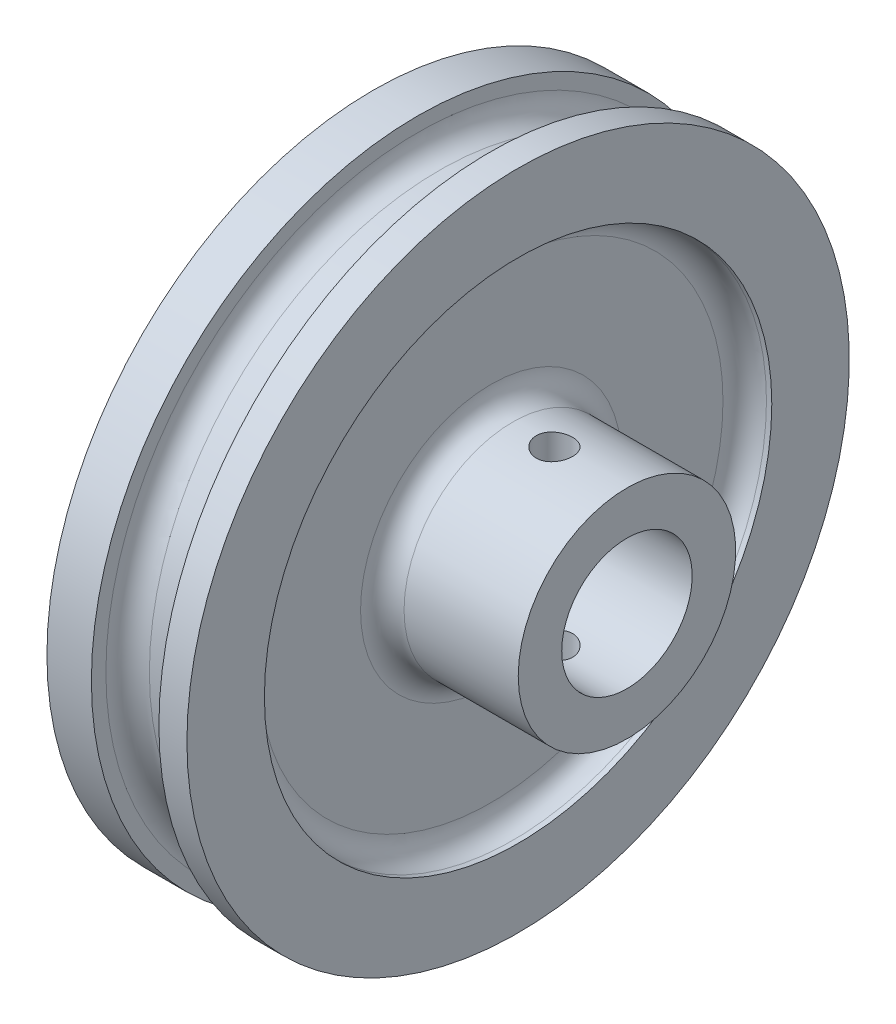
ISO-10303-21;
HEADER;
FILE_DESCRIPTION(('STEP AP214'),'2;1');
FILE_NAME('part.step','',(''),(''),'','','');
FILE_SCHEMA(('AUTOMOTIVE_DESIGN { 1 0 10303 214 1 1 1 1 }'));
ENDSEC;
DATA;
#1=APPLICATION_CONTEXT('core data for automotive mechanical design processes');
#2=APPLICATION_PROTOCOL_DEFINITION('international standard','automotive_design',2000,#1);
#3=PRODUCT_CONTEXT('',#1,'mechanical');
#4=PRODUCT('Part','Part','',(#3));
#5=PRODUCT_RELATED_PRODUCT_CATEGORY('part','',(#4));
#6=PRODUCT_DEFINITION_FORMATION('','',#4);
#7=PRODUCT_DEFINITION_CONTEXT('part definition',#1,'design');
#8=PRODUCT_DEFINITION('design','',#6,#7);
#9=PRODUCT_DEFINITION_SHAPE('','',#8);
#10=(LENGTH_UNIT() NAMED_UNIT(*) SI_UNIT(.MILLI.,.METRE.));
#11=(NAMED_UNIT(*) PLANE_ANGLE_UNIT() SI_UNIT($,.RADIAN.));
#12=(NAMED_UNIT(*) SI_UNIT($,.STERADIAN.) SOLID_ANGLE_UNIT());
#13=UNCERTAINTY_MEASURE_WITH_UNIT(LENGTH_MEASURE(1.E-05),#10,'distance_accuracy_value','');
#14=(GEOMETRIC_REPRESENTATION_CONTEXT(3) GLOBAL_UNCERTAINTY_ASSIGNED_CONTEXT((#13)) GLOBAL_UNIT_ASSIGNED_CONTEXT((#10,
#11,#12)) REPRESENTATION_CONTEXT('',''));
#15=CARTESIAN_POINT('',(0.,0.,0.));
#16=DIRECTION('',(0.,0.,1.));
#17=DIRECTION('',(1.,0.,0.));
#18=AXIS2_PLACEMENT_3D('',#15,#16,#17);
#19=CARTESIAN_POINT('',(-13.6376047809108,45.,0.));
#20=DIRECTION('',(1.,0.,0.));
#21=DIRECTION('',(0.,0.,-1.));
#22=AXIS2_PLACEMENT_3D('',#19,#20,#21);
#23=PLANE('',#22);
#24=CARTESIAN_POINT('',(-13.6376047809108,0.,0.));
#25=DIRECTION('',(-1.,0.,0.));
#26=DIRECTION('',(0.,0.,1.));
#27=AXIS2_PLACEMENT_3D('',#24,#25,#26);
#28=CIRCLE('',#27,9.);
#29=CARTESIAN_POINT('',(-13.6376047809108,0.,9.));
#30=VERTEX_POINT('',#29);
#31=EDGE_CURVE('E201',#30,#30,#28,.T.);
#32=ORIENTED_EDGE('',*,*,#31,.F.);
#33=EDGE_LOOP('',(#32));
#34=FACE_BOUND('',#33,.T.);
#35=CARTESIAN_POINT('',(-13.6376047809108,0.,0.));
#36=DIRECTION('',(-1.,0.,0.));
#37=DIRECTION('',(0.,0.,1.));
#38=AXIS2_PLACEMENT_3D('',#35,#36,#37);
#39=CIRCLE('',#38,45.);
#40=CARTESIAN_POINT('',(-13.6376047809108,0.,45.));
#41=VERTEX_POINT('',#40);
#42=EDGE_CURVE('E10',#41,#41,#39,.T.);
#43=ORIENTED_EDGE('',*,*,#42,.T.);
#44=EDGE_LOOP('',(#43));
#45=FACE_BOUND('',#44,.T.);
#46=ADVANCED_FACE('F37',(#34,#45),#23,.F.);
#47=CARTESIAN_POINT('',(-27.2989690721649,0.,0.));
#48=DIRECTION('',(-1.,0.,0.));
#49=DIRECTION('',(0.,0.,1.));
#50=AXIS2_PLACEMENT_3D('',#47,#48,#49);
#51=CYLINDRICAL_SURFACE('',#50,45.);
#52=ORIENTED_EDGE('',*,*,#42,.F.);
#53=EDGE_LOOP('',(#52));
#54=FACE_BOUND('',#53,.T.);
#55=CARTESIAN_POINT('',(-7.50515463917525,0.,0.));
#56=DIRECTION('',(-1.,0.,0.));
#57=DIRECTION('',(0.,0.,1.));
#58=AXIS2_PLACEMENT_3D('',#55,#56,#57);
#59=CIRCLE('',#58,45.);
#60=CARTESIAN_POINT('',(-7.50515463917525,0.,45.));
#61=VERTEX_POINT('',#60);
#62=EDGE_CURVE('E50',#61,#61,#59,.T.);
#63=ORIENTED_EDGE('',*,*,#62,.T.);
#64=EDGE_LOOP('',(#63));
#65=FACE_BOUND('',#64,.T.);
#66=ADVANCED_FACE('F139',(#54,#65),#51,.T.);
#67=CARTESIAN_POINT('',(-7.50515463917525,43.,0.));
#68=DIRECTION('',(-1.,0.,0.));
#69=DIRECTION('',(0.,0.,1.));
#70=AXIS2_PLACEMENT_3D('',#67,#68,#69);
#71=PLANE('',#70);
#72=ORIENTED_EDGE('',*,*,#62,.F.);
#73=EDGE_LOOP('',(#72));
#74=FACE_BOUND('',#73,.T.);
#75=CARTESIAN_POINT('',(-7.50515463917525,0.,0.));
#76=DIRECTION('',(-1.,0.,0.));
#77=DIRECTION('',(0.,0.,1.));
#78=AXIS2_PLACEMENT_3D('',#75,#76,#77);
#79=CIRCLE('',#78,43.);
#80=CARTESIAN_POINT('',(-7.50515463917525,0.,43.));
#81=VERTEX_POINT('',#80);
#82=EDGE_CURVE('E56',#81,#81,#79,.T.);
#83=ORIENTED_EDGE('',*,*,#82,.T.);
#84=EDGE_LOOP('',(#83));
#85=FACE_BOUND('',#84,.T.);
#86=ADVANCED_FACE('F136',(#74,#85),#71,.F.);
#87=CARTESIAN_POINT('',(-4.50515463917525,0.,0.));
#88=DIRECTION('',(-1.,0.,0.));
#89=DIRECTION('',(0.,0.,1.));
#90=AXIS2_PLACEMENT_3D('',#87,#88,#89);
#91=TOROIDAL_SURFACE('',#90,43.,3.);
#92=ORIENTED_EDGE('',*,*,#82,.F.);
#93=EDGE_LOOP('',(#92));
#94=FACE_BOUND('',#93,.T.);
#95=CARTESIAN_POINT('',(-4.50515463917523,0.,0.));
#96=DIRECTION('',(-1.,0.,0.));
#97=DIRECTION('',(0.,0.,1.));
#98=AXIS2_PLACEMENT_3D('',#95,#96,#97);
#99=CIRCLE('',#98,40.);
#100=CARTESIAN_POINT('',(-4.50515463917523,0.,40.));
#101=VERTEX_POINT('',#100);
#102=EDGE_CURVE('E153',#101,#101,#99,.T.);
#103=ORIENTED_EDGE('',*,*,#102,.T.);
#104=EDGE_LOOP('',(#103));
#105=FACE_BOUND('',#104,.T.);
#106=ADVANCED_FACE('F132',(#94,#105),#91,.F.);
#107=CARTESIAN_POINT('',(-27.2989690721649,0.,0.));
#108=DIRECTION('',(-1.,0.,0.));
#109=DIRECTION('',(0.,0.,1.));
#110=AXIS2_PLACEMENT_3D('',#107,#108,#109);
#111=CYLINDRICAL_SURFACE('',#110,40.);
#112=ORIENTED_EDGE('',*,*,#102,.F.);
#113=EDGE_LOOP('',(#112));
#114=FACE_BOUND('',#113,.T.);
#115=CARTESIAN_POINT('',(-0.505154639175269,0.,0.));
#116=DIRECTION('',(-1.,0.,0.));
#117=DIRECTION('',(0.,0.,1.));
#118=AXIS2_PLACEMENT_3D('',#115,#116,#117);
#119=CIRCLE('',#118,40.);
#120=CARTESIAN_POINT('',(-0.505154639175269,0.,40.));
#121=VERTEX_POINT('',#120);
#122=EDGE_CURVE('E156',#121,#121,#119,.T.);
#123=ORIENTED_EDGE('',*,*,#122,.T.);
#124=EDGE_LOOP('',(#123));
#125=FACE_BOUND('',#124,.T.);
#126=ADVANCED_FACE('F128',(#114,#125),#111,.T.);
#127=CARTESIAN_POINT('',(-0.505154639175247,0.,0.));
#128=DIRECTION('',(-1.,0.,0.));
#129=DIRECTION('',(0.,0.,1.));
#130=AXIS2_PLACEMENT_3D('',#127,#128,#129);
#131=TOROIDAL_SURFACE('',#130,43.,3.);
#132=ORIENTED_EDGE('',*,*,#122,.F.);
#133=EDGE_LOOP('',(#132));
#134=FACE_BOUND('',#133,.T.);
#135=CARTESIAN_POINT('',(2.49484536082475,0.,0.));
#136=DIRECTION('',(-1.,0.,0.));
#137=DIRECTION('',(0.,0.,1.));
#138=AXIS2_PLACEMENT_3D('',#135,#136,#137);
#139=CIRCLE('',#138,43.);
#140=CARTESIAN_POINT('',(2.49484536082475,0.,43.));
#141=VERTEX_POINT('',#140);
#142=EDGE_CURVE('E162',#141,#141,#139,.T.);
#143=ORIENTED_EDGE('',*,*,#142,.T.);
#144=EDGE_LOOP('',(#143));
#145=FACE_BOUND('',#144,.T.);
#146=ADVANCED_FACE('F124',(#134,#145),#131,.F.);
#147=CARTESIAN_POINT('',(2.49484536082475,45.6877000419531,0.));
#148=DIRECTION('',(1.,0.,0.));
#149=DIRECTION('',(0.,0.,-1.));
#150=AXIS2_PLACEMENT_3D('',#147,#148,#149);
#151=PLANE('',#150);
#152=ORIENTED_EDGE('',*,*,#142,.F.);
#153=EDGE_LOOP('',(#152));
#154=FACE_BOUND('',#153,.T.);
#155=CARTESIAN_POINT('',(2.49484536082475,0.,0.));
#156=DIRECTION('',(-1.,0.,0.));
#157=DIRECTION('',(0.,0.,1.));
#158=AXIS2_PLACEMENT_3D('',#155,#156,#157);
#159=CIRCLE('',#158,45.6877000419531);
#160=CARTESIAN_POINT('',(2.49484536082475,0.,45.6877000419531));
#161=VERTEX_POINT('',#160);
#162=EDGE_CURVE('E166',#161,#161,#159,.T.);
#163=ORIENTED_EDGE('',*,*,#162,.T.);
#164=EDGE_LOOP('',(#163));
#165=FACE_BOUND('',#164,.T.);
#166=ADVANCED_FACE('F120',(#154,#165),#151,.F.);
#167=CARTESIAN_POINT('',(-27.2989690721649,0.,0.));
#168=DIRECTION('',(-1.,0.,0.));
#169=DIRECTION('',(0.,0.,1.));
#170=AXIS2_PLACEMENT_3D('',#167,#168,#169);
#171=CYLINDRICAL_SURFACE('',#170,45.6877000419531);
#172=ORIENTED_EDGE('',*,*,#162,.F.);
#173=EDGE_LOOP('',(#172));
#174=FACE_BOUND('',#173,.T.);
#175=CARTESIAN_POINT('',(6.36239521908918,0.,0.));
#176=DIRECTION('',(-1.,0.,0.));
#177=DIRECTION('',(0.,0.,1.));
#178=AXIS2_PLACEMENT_3D('',#175,#176,#177);
#179=CIRCLE('',#178,45.6877000419531);
#180=CARTESIAN_POINT('',(6.36239521908918,0.,45.6877000419531));
#181=VERTEX_POINT('',#180);
#182=EDGE_CURVE('E170',#181,#181,#179,.T.);
#183=ORIENTED_EDGE('',*,*,#182,.T.);
#184=EDGE_LOOP('',(#183));
#185=FACE_BOUND('',#184,.T.);
#186=ADVANCED_FACE('F116',(#174,#185),#171,.T.);
#187=CARTESIAN_POINT('',(6.36239521908918,35.,0.));
#188=DIRECTION('',(-1.,0.,0.));
#189=DIRECTION('',(0.,0.,1.));
#190=AXIS2_PLACEMENT_3D('',#187,#188,#189);
#191=PLANE('',#190);
#192=ORIENTED_EDGE('',*,*,#182,.F.);
#193=EDGE_LOOP('',(#192));
#194=FACE_BOUND('',#193,.T.);
#195=CARTESIAN_POINT('',(6.36239521908918,0.,0.));
#196=DIRECTION('',(-1.,0.,0.));
#197=DIRECTION('',(0.,0.,1.));
#198=AXIS2_PLACEMENT_3D('',#195,#196,#197);
#199=CIRCLE('',#198,35.);
#200=CARTESIAN_POINT('',(6.36239521908918,0.,35.));
#201=VERTEX_POINT('',#200);
#202=EDGE_CURVE('E174',#201,#201,#199,.T.);
#203=ORIENTED_EDGE('',*,*,#202,.T.);
#204=EDGE_LOOP('',(#203));
#205=FACE_BOUND('',#204,.T.);
#206=ADVANCED_FACE('F112',(#194,#205),#191,.F.);
#207=CARTESIAN_POINT('',(-27.2989690721649,0.,0.));
#208=DIRECTION('',(-1.,0.,0.));
#209=DIRECTION('',(0.,0.,1.));
#210=AXIS2_PLACEMENT_3D('',#207,#208,#209);
#211=CYLINDRICAL_SURFACE('',#210,35.);
#212=ORIENTED_EDGE('',*,*,#202,.F.);
#213=EDGE_LOOP('',(#212));
#214=FACE_BOUND('',#213,.T.);
#215=CARTESIAN_POINT('',(5.62724428910501,0.,0.));
#216=DIRECTION('',(-1.,0.,0.));
#217=DIRECTION('',(0.,0.,1.));
#218=AXIS2_PLACEMENT_3D('',#215,#216,#217);
#219=CIRCLE('',#218,35.);
#220=CARTESIAN_POINT('',(5.62724428910501,0.,35.));
#221=VERTEX_POINT('',#220);
#222=EDGE_CURVE('E178',#221,#221,#219,.T.);
#223=ORIENTED_EDGE('',*,*,#222,.T.);
#224=EDGE_LOOP('',(#223));
#225=FACE_BOUND('',#224,.T.);
#226=ADVANCED_FACE('F108',(#214,#225),#211,.F.);
#227=CARTESIAN_POINT('',(5.62724428910499,0.,0.));
#228=DIRECTION('',(-1.,0.,0.));
#229=DIRECTION('',(0.,0.,1.));
#230=AXIS2_PLACEMENT_3D('',#227,#228,#229);
#231=TOROIDAL_SURFACE('',#230,32.,3.);
#232=ORIENTED_EDGE('',*,*,#222,.F.);
#233=EDGE_LOOP('',(#232));
#234=FACE_BOUND('',#233,.T.);
#235=CARTESIAN_POINT('',(2.62724428910499,0.,0.));
#236=DIRECTION('',(-1.,0.,0.));
#237=DIRECTION('',(0.,0.,1.));
#238=AXIS2_PLACEMENT_3D('',#235,#236,#237);
#239=CIRCLE('',#238,32.);
#240=CARTESIAN_POINT('',(2.62724428910499,0.,32.));
#241=VERTEX_POINT('',#240);
#242=EDGE_CURVE('E182',#241,#241,#239,.T.);
#243=ORIENTED_EDGE('',*,*,#242,.T.);
#244=EDGE_LOOP('',(#243));
#245=FACE_BOUND('',#244,.T.);
#246=ADVANCED_FACE('F104',(#234,#245),#231,.F.);
#247=CARTESIAN_POINT('',(2.62724428910499,18.,0.));
#248=DIRECTION('',(-1.,0.,0.));
#249=DIRECTION('',(0.,0.,1.));
#250=AXIS2_PLACEMENT_3D('',#247,#248,#249);
#251=PLANE('',#250);
#252=ORIENTED_EDGE('',*,*,#242,.F.);
#253=EDGE_LOOP('',(#252));
#254=FACE_BOUND('',#253,.T.);
#255=CARTESIAN_POINT('',(2.62724428910499,0.,0.));
#256=DIRECTION('',(-1.,0.,0.));
#257=DIRECTION('',(0.,0.,1.));
#258=AXIS2_PLACEMENT_3D('',#255,#256,#257);
#259=CIRCLE('',#258,18.);
#260=CARTESIAN_POINT('',(2.62724428910499,0.,18.));
#261=VERTEX_POINT('',#260);
#262=EDGE_CURVE('E186',#261,#261,#259,.T.);
#263=ORIENTED_EDGE('',*,*,#262,.T.);
#264=EDGE_LOOP('',(#263));
#265=FACE_BOUND('',#264,.T.);
#266=ADVANCED_FACE('F100',(#254,#265),#251,.F.);
#267=CARTESIAN_POINT('',(5.62724428910499,0.,0.));
#268=DIRECTION('',(-1.,0.,0.));
#269=DIRECTION('',(0.,0.,1.));
#270=AXIS2_PLACEMENT_3D('',#267,#268,#269);
#271=TOROIDAL_SURFACE('',#270,18.,3.);
#272=ORIENTED_EDGE('',*,*,#262,.F.);
#273=EDGE_LOOP('',(#272));
#274=FACE_BOUND('',#273,.T.);
#275=CARTESIAN_POINT('',(5.62724428910501,0.,0.));
#276=DIRECTION('',(-1.,0.,0.));
#277=DIRECTION('',(0.,0.,1.));
#278=AXIS2_PLACEMENT_3D('',#275,#276,#277);
#279=CIRCLE('',#278,15.);
#280=CARTESIAN_POINT('',(5.62724428910501,0.,15.));
#281=VERTEX_POINT('',#280);
#282=EDGE_CURVE('E190',#281,#281,#279,.T.);
#283=ORIENTED_EDGE('',*,*,#282,.T.);
#284=EDGE_LOOP('',(#283));
#285=FACE_BOUND('',#284,.T.);
#286=ADVANCED_FACE('F95',(#274,#285),#271,.F.);
#287=CARTESIAN_POINT('',(-27.2989690721649,0.,0.));
#288=DIRECTION('',(-1.,0.,0.));
#289=DIRECTION('',(0.,0.,1.));
#290=AXIS2_PLACEMENT_3D('',#287,#288,#289);
#291=CYLINDRICAL_SURFACE('',#290,15.);
#292=CARTESIAN_POINT('',(11.3798216086926,-14.790199457749,2.5));
#293=CARTESIAN_POINT('',(11.5191973568544,-14.790201973666,2.49999439841982));
#294=CARTESIAN_POINT('',(11.6586492147641,-14.7921909238523,2.48830516902828));
#295=CARTESIAN_POINT('',(11.9336401519558,-14.7999245720004,2.44187742806637));
#296=CARTESIAN_POINT('',(12.0691755024507,-14.8056727334637,2.40711766030861));
#297=CARTESIAN_POINT('',(12.3323138920342,-14.8202560936731,2.31562954367049));
#298=CARTESIAN_POINT('',(12.4599234573549,-14.8290887118401,2.25891955493199));
#299=CARTESIAN_POINT('',(12.7038025634104,-14.8488427210228,2.12518649688947));
#300=CARTESIAN_POINT('',(12.82007337827,-14.8597638769423,2.04816571350133));
#301=CARTESIAN_POINT('',(13.0391344584372,-14.8825847115588,1.87518752696654));
#302=CARTESIAN_POINT('',(13.1417967400788,-14.8944921732795,1.77906904893234));
#303=CARTESIAN_POINT('',(13.3296149155544,-14.9178748066858,1.57097200469527));
#304=CARTESIAN_POINT('',(13.414769771808,-14.9293499527174,1.45899249914997));
#305=CARTESIAN_POINT('',(13.5656361759119,-14.9506573698271,1.22152286994835));
#306=CARTESIAN_POINT('',(13.6312286164244,-14.9604794243234,1.09595608145671));
#307=CARTESIAN_POINT('',(13.7403426792232,-14.9772873695709,0.835395621723867));
#308=CARTESIAN_POINT('',(13.7838657365775,-14.9842734447266,0.700402564078187));
#309=CARTESIAN_POINT('',(13.8472141436765,-14.994567347244,0.426143726344242));
#310=CARTESIAN_POINT('',(13.8672545246973,-14.9979085311091,0.286928886679271));
#311=CARTESIAN_POINT('',(13.8837373628452,-15.0006507934278,0.00707528552579728));
#312=CARTESIAN_POINT('',(13.8801814239399,-15.0000521396931,-0.133563378528898));
#313=CARTESIAN_POINT('',(13.8497402571644,-14.9950085843139,-0.410802185078875));
#314=CARTESIAN_POINT('',(13.8230864452835,-14.990601836924,-0.54742853070014));
#315=CARTESIAN_POINT('',(13.7475705344461,-14.9784797877164,-0.81424197961179));
#316=CARTESIAN_POINT('',(13.6987077591031,-14.9707643851321,-0.944428886651503));
#317=CARTESIAN_POINT('',(13.5799309683773,-14.9528269851196,-1.19535614778265));
#318=CARTESIAN_POINT('',(13.5099215966102,-14.9425936732688,-1.31605052301904));
#319=CARTESIAN_POINT('',(13.3509087860576,-14.920757380715,-1.54406552984664));
#320=CARTESIAN_POINT('',(13.2619038099818,-14.9091542891913,-1.65138507791587));
#321=CARTESIAN_POINT('',(13.0661428020733,-14.885702682326,-1.85097127344666));
#322=CARTESIAN_POINT('',(12.9591845137916,-14.8738528973104,-1.94303950225321));
#323=CARTESIAN_POINT('',(12.7312345184768,-14.8513795978481,-2.10795458844806));
#324=CARTESIAN_POINT('',(12.6102426820098,-14.8407560947132,-2.18080126853242));
#325=CARTESIAN_POINT('',(12.3574299668151,-14.8219375456182,-2.30524443448828));
#326=CARTESIAN_POINT('',(12.2255971106005,-14.813745233026,-2.35681702727924));
#327=CARTESIAN_POINT('',(11.9549725363851,-14.8007618868988,-2.43702987081562));
#328=CARTESIAN_POINT('',(11.8161814322602,-14.7959705538832,-2.46567214076795));
#329=CARTESIAN_POINT('',(11.5373554525305,-14.7903895942212,-2.49893188487926));
#330=CARTESIAN_POINT('',(11.3973552289905,-14.7895528575867,-2.50383220791244));
#331=CARTESIAN_POINT('',(11.1185349370018,-14.7918503478236,-2.49022270268246));
#332=CARTESIAN_POINT('',(10.9797148231787,-14.7949844213185,-2.47171377862466));
#333=CARTESIAN_POINT('',(10.7080938495018,-14.8048268745502,-2.4120523349281));
#334=CARTESIAN_POINT('',(10.5752604688146,-14.8115125191835,-2.37104379064638));
#335=CARTESIAN_POINT('',(10.3183514424131,-14.827685730055,-2.26769819019228));
#336=CARTESIAN_POINT('',(10.1942763211417,-14.8371734639058,-2.20535985810094));
#337=CARTESIAN_POINT('',(9.95714701428651,-14.8579912839739,-2.06045667322923));
#338=CARTESIAN_POINT('',(9.84420503593656,-14.8693375560035,-1.97771056415936));
#339=CARTESIAN_POINT('',(9.63370807599762,-14.8925466667987,-1.79458946570798));
#340=CARTESIAN_POINT('',(9.53615417758288,-14.9044095418533,-1.69421323638404));
#341=CARTESIAN_POINT('',(9.35816971596392,-14.9274642211826,-1.47742807032881));
#342=CARTESIAN_POINT('',(9.27792778240808,-14.9386477634467,-1.3608632533862));
#343=CARTESIAN_POINT('',(9.13816628168774,-14.9589511243294,-1.11574344794933));
#344=CARTESIAN_POINT('',(9.07864604421877,-14.9680710096998,-0.987188847470626));
#345=CARTESIAN_POINT('',(8.98231102473776,-14.9831835816958,-0.722299051501328));
#346=CARTESIAN_POINT('',(8.9453975329577,-14.9891898456762,-0.586000562602611));
#347=CARTESIAN_POINT('',(8.89500600972879,-14.9974558316928,-0.309030734874212));
#348=CARTESIAN_POINT('',(8.88152604996027,-14.9997158620019,-0.168359756821621));
#349=CARTESIAN_POINT('',(8.87843972638042,-15.0002303788781,0.111541275773676));
#350=CARTESIAN_POINT('',(8.88854635475154,-14.9985330202419,0.250768160602665));
#351=CARTESIAN_POINT('',(8.93172553096205,-14.9914217838733,0.525511974314705));
#352=CARTESIAN_POINT('',(8.96479795020229,-14.9860079269518,0.661028923967478));
#353=CARTESIAN_POINT('',(9.05285977423627,-14.972069888274,0.924396445918536));
#354=CARTESIAN_POINT('',(9.10782477690267,-14.9635491704088,1.05225537215382));
#355=CARTESIAN_POINT('',(9.2380795449232,-14.9443275687803,1.29698045298217));
#356=CARTESIAN_POINT('',(9.31337027375507,-14.9336265816741,1.41384608611822));
#357=CARTESIAN_POINT('',(9.48315670115312,-14.9110762961641,1.63471294552639));
#358=CARTESIAN_POINT('',(9.57786256344388,-14.8992152454112,1.73855143060274));
#359=CARTESIAN_POINT('',(9.78334991659643,-14.8757630331437,1.92896387595091));
#360=CARTESIAN_POINT('',(9.89413516760515,-14.8641719354951,2.0155337867119));
#361=CARTESIAN_POINT('',(10.1295669311822,-14.8424834353391,2.16951427091086));
#362=CARTESIAN_POINT('',(10.2543059484581,-14.8323971784578,2.2367849890577));
#363=CARTESIAN_POINT('',(10.5134308445308,-14.8149921009131,2.34931453640427));
#364=CARTESIAN_POINT('',(10.64780693137,-14.8076705172488,2.39459535522307));
#365=CARTESIAN_POINT('',(10.88222537818,-14.7982474485649,2.45202605312742));
#366=CARTESIAN_POINT('',(10.9808484166552,-14.7952462341947,2.46998741767139));
#367=CARTESIAN_POINT('',(11.1795750935296,-14.7912213528807,2.49397629518131));
#368=CARTESIAN_POINT('',(11.2796787050168,-14.7901976500369,2.50000402479277));
#369=CARTESIAN_POINT('',(11.3798216086926,-14.790199457749,2.5));
#370=B_SPLINE_CURVE_WITH_KNOTS('',3,(#292,#293,#294,#295,#296,#297,#298,#299,#300,#301,#302,
#303,#304,#305,#306,#307,#308,#309,#310,#311,#312,#313,#314,#315,#316,#317,#318,#319,#320,#321,
#322,#323,#324,#325,#326,#327,#328,#329,#330,#331,#332,#333,#334,#335,#336,#337,#338,#339,#340,
#341,#342,#343,#344,#345,#346,#347,#348,#349,#350,#351,#352,#353,#354,#355,#356,#357,#358,#359,
#360,#361,#362,#363,#364,#365,#366,#367,#368,#369),.UNSPECIFIED.,.T.,.F.,(4,2,2,2,2,2,2,2,2,2,2,
2,2,2,2,2,2,2,2,2,2,2,2,2,2,2,2,2,2,2,2,2,2,2,2,2,2,2,4),(0.,0.41776103892774,0.83590751996297,
1.25370499787519,1.67145547405274,2.09289159155714,2.51435267834447,2.93832980111435,
3.36227935111113,3.78231567472565,4.20232344652692,4.61817121164668,5.03403164249533,
5.45179604139425,5.86959426226764,6.29246123462123,6.71533210746018,7.13867662498603,
7.56198385938076,7.9802354242041,8.39847083413975,8.81406064635491,9.22967532293574,
9.64912342762701,10.0686010443069,10.4924411303538,10.916267504767,11.3382298441765,
11.7601574591235,12.1769777626592,12.5937957321882,13.0101503983246,13.4265248039233,
13.8476699746325,14.2689137888181,14.6931372761832,15.1169356674445,15.4171067054376,
15.7172722940182),.UNSPECIFIED.);
#371=CARTESIAN_POINT('',(11.3798216086926,-14.790199457749,2.5));
#372=VERTEX_POINT('',#371);
#373=EDGE_CURVE('E85',#372,#372,#370,.T.);
#374=ORIENTED_EDGE('',*,*,#373,.T.);
#375=EDGE_LOOP('',(#374));
#376=FACE_BOUND('',#375,.T.);
#377=CARTESIAN_POINT('',(11.3798216086926,14.790199457749,2.5));
#378=CARTESIAN_POINT('',(11.2404458605308,14.790201973666,2.49999439841982));
#379=CARTESIAN_POINT('',(11.1009940026211,14.7921909238523,2.48830516902828));
#380=CARTESIAN_POINT('',(10.8260030654295,14.7999245720004,2.44187742806637));
#381=CARTESIAN_POINT('',(10.6904677149346,14.8056727334637,2.40711766030861));
#382=CARTESIAN_POINT('',(10.427329325351,14.8202560936731,2.31562954367049));
#383=CARTESIAN_POINT('',(10.2997197600304,14.8290887118401,2.25891955493199));
#384=CARTESIAN_POINT('',(10.0558406539748,14.8488427210228,2.12518649688947));
#385=CARTESIAN_POINT('',(9.93956983911529,14.8597638769423,2.04816571350133));
#386=CARTESIAN_POINT('',(9.72050875894806,14.8825847115588,1.87518752696654));
#387=CARTESIAN_POINT('',(9.61784647730641,14.8944921732795,1.77906904893234));
#388=CARTESIAN_POINT('',(9.43002830183081,14.9178748066858,1.57097200469527));
#389=CARTESIAN_POINT('',(9.3448734455772,14.9293499527174,1.45899249914997));
#390=CARTESIAN_POINT('',(9.19400704147335,14.9506573698271,1.22152286994835));
#391=CARTESIAN_POINT('',(9.12841460096082,14.9604794243234,1.09595608145671));
#392=CARTESIAN_POINT('',(9.01930053816207,14.9772873695709,0.835395621723867));
#393=CARTESIAN_POINT('',(8.97577748080774,14.9842734447266,0.700402564078187));
#394=CARTESIAN_POINT('',(8.91242907370872,14.994567347244,0.426143726344242));
#395=CARTESIAN_POINT('',(8.89238869268793,14.9979085311091,0.286928886679271));
#396=CARTESIAN_POINT('',(8.87590585454002,15.0006507934278,0.00707528552579728));
#397=CARTESIAN_POINT('',(8.87946179344539,15.0000521396931,-0.133563378528898));
#398=CARTESIAN_POINT('',(8.90990296022083,14.9950085843139,-0.410802185078875));
#399=CARTESIAN_POINT('',(8.93655677210177,14.990601836924,-0.54742853070014));
#400=CARTESIAN_POINT('',(9.01207268293911,14.9784797877164,-0.81424197961179));
#401=CARTESIAN_POINT('',(9.06093545828212,14.9707643851321,-0.944428886651503));
#402=CARTESIAN_POINT('',(9.17971224900794,14.9528269851196,-1.19535614778265));
#403=CARTESIAN_POINT('',(9.24972162077506,14.9425936732688,-1.31605052301904));
#404=CARTESIAN_POINT('',(9.40873443132767,14.920757380715,-1.54406552984664));
#405=CARTESIAN_POINT('',(9.49773940740344,14.9091542891913,-1.65138507791587));
#406=CARTESIAN_POINT('',(9.69350041531193,14.885702682326,-1.85097127344666));
#407=CARTESIAN_POINT('',(9.8004587035936,14.8738528973104,-1.94303950225321));
#408=CARTESIAN_POINT('',(10.0284086989084,14.8513795978481,-2.10795458844806));
#409=CARTESIAN_POINT('',(10.1494005353754,14.8407560947132,-2.18080126853241));
#410=CARTESIAN_POINT('',(10.4022132505701,14.8219375456182,-2.30524443448828));
#411=CARTESIAN_POINT('',(10.5340461067847,14.813745233026,-2.35681702727924));
#412=CARTESIAN_POINT('',(10.8046706810002,14.8007618868988,-2.43702987081562));
#413=CARTESIAN_POINT('',(10.943461785125,14.7959705538832,-2.46567214076795));
#414=CARTESIAN_POINT('',(11.2222877648548,14.7903895942212,-2.49893188487927));
#415=CARTESIAN_POINT('',(11.3622879883947,14.7895528575867,-2.50383220791244));
#416=CARTESIAN_POINT('',(11.6411082803834,14.7918503478236,-2.49022270268246));
#417=CARTESIAN_POINT('',(11.7799283942066,14.7949844213185,-2.47171377862466));
#418=CARTESIAN_POINT('',(12.0515493678835,14.8048268745502,-2.4120523349281));
#419=CARTESIAN_POINT('',(12.1843827485706,14.8115125191835,-2.37104379064638));
#420=CARTESIAN_POINT('',(12.4412917749721,14.827685730055,-2.26769819019228));
#421=CARTESIAN_POINT('',(12.5653668962435,14.8371734639058,-2.20535985810094));
#422=CARTESIAN_POINT('',(12.8024962030987,14.8579912839739,-2.06045667322923));
#423=CARTESIAN_POINT('',(12.9154381814487,14.8693375560035,-1.97771056415936));
#424=CARTESIAN_POINT('',(13.1259351413876,14.8925466667987,-1.79458946570798));
#425=CARTESIAN_POINT('',(13.2234890398024,14.9044095418533,-1.69421323638404));
#426=CARTESIAN_POINT('',(13.4014735014213,14.9274642211826,-1.47742807032881));
#427=CARTESIAN_POINT('',(13.4817154349772,14.9386477634467,-1.3608632533862));
#428=CARTESIAN_POINT('',(13.6214769356975,14.9589511243294,-1.11574344794933));
#429=CARTESIAN_POINT('',(13.6809971731665,14.9680710096998,-0.987188847470626));
#430=CARTESIAN_POINT('',(13.7773321926475,14.9831835816958,-0.722299051501328));
#431=CARTESIAN_POINT('',(13.8142456844275,14.9891898456762,-0.586000562602611));
#432=CARTESIAN_POINT('',(13.8646372076564,14.9974558316928,-0.309030734874212));
#433=CARTESIAN_POINT('',(13.878117167425,14.9997158620019,-0.168359756821621));
#434=CARTESIAN_POINT('',(13.8812034910048,15.0002303788781,0.111541275773676));
#435=CARTESIAN_POINT('',(13.8710968626337,14.9985330202419,0.250768160602665));
#436=CARTESIAN_POINT('',(13.8279176864232,14.9914217838733,0.525511974314705));
#437=CARTESIAN_POINT('',(13.794845267183,14.9860079269518,0.661028923967478));
#438=CARTESIAN_POINT('',(13.706783443149,14.972069888274,0.924396445918535));
#439=CARTESIAN_POINT('',(13.6518184404826,14.9635491704088,1.05225537215382));
#440=CARTESIAN_POINT('',(13.521563672462,14.9443275687803,1.29698045298216));
#441=CARTESIAN_POINT('',(13.4462729436302,14.9336265816741,1.41384608611822));
#442=CARTESIAN_POINT('',(13.2764865162321,14.9110762961641,1.63471294552639));
#443=CARTESIAN_POINT('',(13.1817806539414,14.8992152454112,1.73855143060274));
#444=CARTESIAN_POINT('',(12.9762933007888,14.8757630331437,1.92896387595091));
#445=CARTESIAN_POINT('',(12.8655080497801,14.8641719354951,2.0155337867119));
#446=CARTESIAN_POINT('',(12.630076286203,14.8424834353391,2.16951427091086));
#447=CARTESIAN_POINT('',(12.5053372689271,14.8323971784578,2.2367849890577));
#448=CARTESIAN_POINT('',(12.2462123728545,14.8149921009131,2.34931453640427));
#449=CARTESIAN_POINT('',(12.1118362860153,14.8076705172488,2.39459535522307));
#450=CARTESIAN_POINT('',(11.8774178392052,14.7982474485649,2.45202605312742));
#451=CARTESIAN_POINT('',(11.77879480073,14.7952462341947,2.46998741767139));
#452=CARTESIAN_POINT('',(11.5800681238557,14.7912213528807,2.49397629518131));
#453=CARTESIAN_POINT('',(11.4799645123684,14.7901976500369,2.50000402479277));
#454=CARTESIAN_POINT('',(11.3798216086926,14.790199457749,2.5));
#455=B_SPLINE_CURVE_WITH_KNOTS('',3,(#377,#378,#379,#380,#381,#382,#383,#384,#385,#386,#387,
#388,#389,#390,#391,#392,#393,#394,#395,#396,#397,#398,#399,#400,#401,#402,#403,#404,#405,#406,
#407,#408,#409,#410,#411,#412,#413,#414,#415,#416,#417,#418,#419,#420,#421,#422,#423,#424,#425,
#426,#427,#428,#429,#430,#431,#432,#433,#434,#435,#436,#437,#438,#439,#440,#441,#442,#443,#444,
#445,#446,#447,#448,#449,#450,#451,#452,#453,#454),.UNSPECIFIED.,.T.,.F.,(4,2,2,2,2,2,2,2,2,2,2,
2,2,2,2,2,2,2,2,2,2,2,2,2,2,2,2,2,2,2,2,2,2,2,2,2,2,2,4),(0.,0.41776103892774,0.83590751996297,
1.25370499787519,1.67145547405274,2.09289159155714,2.51435267834447,2.93832980111435,
3.36227935111113,3.78231567472565,4.20232344652692,4.61817121164668,5.03403164249533,
5.45179604139425,5.86959426226764,6.29246123462123,6.71533210746018,7.13867662498603,
7.56198385938077,7.9802354242041,8.39847083413976,8.81406064635491,9.22967532293574,
9.64912342762701,10.0686010443069,10.4924411303538,10.916267504767,11.3382298441765,
11.7601574591235,12.1769777626592,12.5937957321882,13.0101503983246,13.4265248039233,
13.8476699746325,14.2689137888181,14.6931372761832,15.1169356674445,15.4171067054376,
15.7172722940182),.UNSPECIFIED.);
#456=CARTESIAN_POINT('',(11.3798216086926,14.790199457749,2.5));
#457=VERTEX_POINT('',#456);
#458=EDGE_CURVE('E78',#457,#457,#455,.T.);
#459=ORIENTED_EDGE('',*,*,#458,.T.);
#460=EDGE_LOOP('',(#459));
#461=FACE_BOUND('',#460,.T.);
#462=ORIENTED_EDGE('',*,*,#282,.F.);
#463=EDGE_LOOP('',(#462));
#464=FACE_BOUND('',#463,.T.);
#465=CARTESIAN_POINT('',(21.3798216086926,0.,0.));
#466=DIRECTION('',(-1.,0.,0.));
#467=DIRECTION('',(0.,0.,1.));
#468=AXIS2_PLACEMENT_3D('',#465,#466,#467);
#469=CIRCLE('',#468,15.);
#470=CARTESIAN_POINT('',(21.3798216086926,0.,15.));
#471=VERTEX_POINT('',#470);
#472=EDGE_CURVE('E194',#471,#471,#469,.T.);
#473=ORIENTED_EDGE('',*,*,#472,.T.);
#474=EDGE_LOOP('',(#473));
#475=FACE_BOUND('',#474,.T.);
#476=ADVANCED_FACE('F90',(#376,#461,#464,#475),#291,.T.);
#477=CARTESIAN_POINT('',(21.3798216086926,9.,0.));
#478=DIRECTION('',(-1.,0.,0.));
#479=DIRECTION('',(0.,0.,1.));
#480=AXIS2_PLACEMENT_3D('',#477,#478,#479);
#481=PLANE('',#480);
#482=ORIENTED_EDGE('',*,*,#472,.F.);
#483=EDGE_LOOP('',(#482));
#484=FACE_BOUND('',#483,.T.);
#485=CARTESIAN_POINT('',(21.3798216086926,0.,0.));
#486=DIRECTION('',(-1.,0.,0.));
#487=DIRECTION('',(0.,0.,1.));
#488=AXIS2_PLACEMENT_3D('',#485,#486,#487);
#489=CIRCLE('',#488,9.);
#490=CARTESIAN_POINT('',(21.3798216086926,0.,9.));
#491=VERTEX_POINT('',#490);
#492=EDGE_CURVE('E198',#491,#491,#489,.T.);
#493=ORIENTED_EDGE('',*,*,#492,.T.);
#494=EDGE_LOOP('',(#493));
#495=FACE_BOUND('',#494,.T.);
#496=ADVANCED_FACE('F94',(#484,#495),#481,.F.);
#497=CARTESIAN_POINT('',(-27.2989690721649,0.,0.));
#498=DIRECTION('',(-1.,0.,0.));
#499=DIRECTION('',(0.,0.,1.));
#500=AXIS2_PLACEMENT_3D('',#497,#498,#499);
#501=CYLINDRICAL_SURFACE('',#500,9.);
#502=CARTESIAN_POINT('',(11.3798216086926,-8.64580823289529,2.5));
#503=CARTESIAN_POINT('',(11.2423346554027,-8.64581037496086,2.49999714996617));
#504=CARTESIAN_POINT('',(11.1048183686196,-8.6491236093716,2.48861977425243));
#505=CARTESIAN_POINT('',(10.8337730132614,-8.66197474072459,2.44350693717148));
#506=CARTESIAN_POINT('',(10.700245753415,-8.67151541786232,2.40976148964065));
#507=CARTESIAN_POINT('',(10.4411392819331,-8.69565935423007,2.32112008680785));
#508=CARTESIAN_POINT('',(10.3155485679389,-8.71025507855494,2.26625559744293));
#509=CARTESIAN_POINT('',(10.0753306866372,-8.74285475062134,2.13703377417484));
#510=CARTESIAN_POINT('',(9.9607046344072,-8.76085904445198,2.06267446056935));
#511=CARTESIAN_POINT('',(9.74255975310978,-8.79879482245345,1.89441531907552));
#512=CARTESIAN_POINT('',(9.63938249105645,-8.81876275539879,1.80008077870936));
#513=CARTESIAN_POINT('',(9.45009076965329,-8.85806239814547,1.59548286960028));
#514=CARTESIAN_POINT('',(9.36397820872763,-8.87739403696071,1.48521773095722));
#515=CARTESIAN_POINT('',(9.2098171475314,-8.91365202741974,1.249500428906));
#516=CARTESIAN_POINT('',(9.14211101684822,-8.93053038427289,1.12381632761083));
#517=CARTESIAN_POINT('',(9.02892233493292,-8.95956018312964,0.862300362049424));
#518=CARTESIAN_POINT('',(8.98343570411865,-8.97171249276935,0.726470365890893));
#519=CARTESIAN_POINT('',(8.91709066322003,-8.98966318340414,0.452086360205862));
#520=CARTESIAN_POINT('',(8.89565056643133,-8.99561138050703,0.313682975067016));
#521=CARTESIAN_POINT('',(8.87617415203659,-9.00100867384282,0.0351244568787278));
#522=CARTESIAN_POINT('',(8.8781335971359,-9.00045894674934,-0.105030354422777));
#523=CARTESIAN_POINT('',(8.90499716107643,-8.99303086374216,-0.379054247152545));
#524=CARTESIAN_POINT('',(8.92927237266169,-8.98632598075261,-0.512990410045097));
#525=CARTESIAN_POINT('',(8.99905874692518,-8.96754760099034,-0.77480748332248));
#526=CARTESIAN_POINT('',(9.04457116934771,-8.95547378574645,-0.902688034006089));
#527=CARTESIAN_POINT('',(9.15600368927576,-8.92706250606229,-1.15033359179948));
#528=CARTESIAN_POINT('',(9.22213351821689,-8.91068150784286,-1.26999902658788));
#529=CARTESIAN_POINT('',(9.37276122451239,-8.87541221350138,-1.49674457308826));
#530=CARTESIAN_POINT('',(9.4572629413846,-8.85652339359457,-1.60382204684013));
#531=CARTESIAN_POINT('',(9.64555026646987,-8.81753663226074,-1.80610676038229));
#532=CARTESIAN_POINT('',(9.74988341433837,-8.79741936953618,-1.9008012505898));
#533=CARTESIAN_POINT('',(9.97315428381482,-8.75880383152746,-2.07148108085113));
#534=CARTESIAN_POINT('',(10.092093058811,-8.74030567318147,-2.14746507027557));
#535=CARTESIAN_POINT('',(10.3423863301049,-8.70694013940655,-2.27900238121953));
#536=CARTESIAN_POINT('',(10.4738238779985,-8.69209980055975,-2.33440501640979));
#537=CARTESIAN_POINT('',(10.7446652044511,-8.66806022503139,-2.42215297643582));
#538=CARTESIAN_POINT('',(10.8840668009426,-8.65885945119347,-2.45450458459976));
#539=CARTESIAN_POINT('',(11.1620561226905,-8.64747148287153,-2.49432455486229));
#540=CARTESIAN_POINT('',(11.3005248435016,-8.64506746157861,-2.50256249342185));
#541=CARTESIAN_POINT('',(11.5768635991445,-8.64694988564764,-2.49605092061448));
#542=CARTESIAN_POINT('',(11.7147337020427,-8.65123554925282,-2.48130409524808));
#543=CARTESIAN_POINT('',(11.982919355384,-8.66580389953325,-2.42992241428478));
#544=CARTESIAN_POINT('',(12.1133332775398,-8.67595686836151,-2.39376059864354));
#545=CARTESIAN_POINT('',(12.3662418357935,-8.70098664146817,-2.30111259188306));
#546=CARTESIAN_POINT('',(12.4887353714122,-8.7158641004892,-2.24462358357884));
#547=CARTESIAN_POINT('',(12.7255169772504,-8.74910362417903,-2.11139571215836));
#548=CARTESIAN_POINT('',(12.8395433797308,-8.76753959855501,-2.03421067264883));
#549=CARTESIAN_POINT('',(13.0533078527684,-8.80564999409988,-1.86232721847474));
#550=CARTESIAN_POINT('',(13.1530429933571,-8.825324668038,-1.76762522160664));
#551=CARTESIAN_POINT('',(13.3386430792611,-8.86445019939347,-1.55981743646719));
#552=CARTESIAN_POINT('',(13.4239684187604,-8.88387421295946,-1.44622359870981));
#553=CARTESIAN_POINT('',(13.5743455797701,-8.91967402878593,-1.20588311286948));
#554=CARTESIAN_POINT('',(13.6393984754868,-8.93604999253947,-1.07913716217183));
#555=CARTESIAN_POINT('',(13.746771200516,-8.96380327787493,-0.816978395233257));
#556=CARTESIAN_POINT('',(13.7892627747598,-8.97521823979383,-0.681640101050667));
#557=CARTESIAN_POINT('',(13.8507897821334,-8.99192942838897,-0.405376312895356));
#558=CARTESIAN_POINT('',(13.8698308918362,-8.99722713582853,-0.264452179596266));
#559=CARTESIAN_POINT('',(13.8835359383789,-9.00103042209333,0.0139601523576464));
#560=CARTESIAN_POINT('',(13.8789883157833,-8.99975568986336,0.151407064589649));
#561=CARTESIAN_POINT('',(13.847493046202,-8.99106088846503,0.423500619727718));
#562=CARTESIAN_POINT('',(13.8205463711227,-8.98364108593446,0.558147383873812));
#563=CARTESIAN_POINT('',(13.7454783850644,-8.96353984091205,0.819784983469304));
#564=CARTESIAN_POINT('',(13.6975290107594,-8.95090116936265,0.946828656281136));
#565=CARTESIAN_POINT('',(13.5819696704615,-8.92167820297651,1.19113920788314));
#566=CARTESIAN_POINT('',(13.514356775314,-8.90509332036379,1.30840462671538));
#567=CARTESIAN_POINT('',(13.3591496659769,-8.86915397347008,1.53345112172909));
#568=CARTESIAN_POINT('',(13.271041522624,-8.84973411731035,1.64086726646984));
#569=CARTESIAN_POINT('',(13.0783036782411,-8.8105592080908,1.83965563573724));
#570=CARTESIAN_POINT('',(12.9736695106451,-8.79080406570366,1.93102350868099));
#571=CARTESIAN_POINT('',(12.7477770912484,-8.75263553519991,2.09734241907801));
#572=CARTESIAN_POINT('',(12.6261752191607,-8.73426670491594,2.17183796747972));
#573=CARTESIAN_POINT('',(12.3716776215139,-8.70160385709125,2.29922652645139));
#574=CARTESIAN_POINT('',(12.2387887355125,-8.68730739437859,2.35213250833712));
#575=CARTESIAN_POINT('',(11.9854614789543,-8.6662134577975,2.42859494882475));
#576=CARTESIAN_POINT('',(11.8660322031362,-8.65862660680178,2.45530563406018));
#577=CARTESIAN_POINT('',(11.6243499604683,-8.64842338463345,2.49100820491654));
#578=CARTESIAN_POINT('',(11.5020973854802,-8.64580632782194,2.50000253471396));
#579=CARTESIAN_POINT('',(11.3798216086926,-8.64580823289529,2.5));
#580=B_SPLINE_CURVE_WITH_KNOTS('',3,(#502,#503,#504,#505,#506,#507,#508,#509,#510,#511,#512,
#513,#514,#515,#516,#517,#518,#519,#520,#521,#522,#523,#524,#525,#526,#527,#528,#529,#530,#531,
#532,#533,#534,#535,#536,#537,#538,#539,#540,#541,#542,#543,#544,#545,#546,#547,#548,#549,#550,
#551,#552,#553,#554,#555,#556,#557,#558,#559,#560,#561,#562,#563,#564,#565,#566,#567,#568,#569,
#570,#571,#572,#573,#574,#575,#576,#577,#578,#579),.UNSPECIFIED.,.T.,.F.,(4,2,2,2,2,2,2,2,2,2,2,
2,2,2,2,2,2,2,2,2,2,2,2,2,2,2,2,2,2,2,2,2,2,2,2,2,2,2,4),(0.,0.41201079168896,0.824205648454514,
1.23578872527857,1.64741361462616,2.0691389576003,2.49091119062405,2.9200619675063,
3.34913392107923,3.7675863122474,4.18596292931721,4.59289867518081,4.99985856264055,
5.4111013330343,5.82243013129567,6.24742875551483,6.672458049542,7.10054057407684,
7.52850636571889,7.94265637768504,8.35675799569094,8.76203677700911,9.16737174834453,
9.58226667645631,9.99724654423656,10.4253750626708,10.8534808913584,11.2782793253857,
11.7029749096957,12.1135686473819,12.5241445701257,12.9314203987337,13.3387569278366,
13.7576868945778,14.1767302818544,14.6060087946726,15.0350290098245,15.4015066296816,
15.7679336861631),.UNSPECIFIED.);
#581=CARTESIAN_POINT('',(11.3798216086926,-8.64580823289529,2.5));
#582=VERTEX_POINT('',#581);
#583=EDGE_CURVE('E40',#582,#582,#580,.T.);
#584=ORIENTED_EDGE('',*,*,#583,.T.);
#585=EDGE_LOOP('',(#584));
#586=FACE_BOUND('',#585,.T.);
#587=CARTESIAN_POINT('',(11.3798216086926,8.64580823289529,2.5));
#588=CARTESIAN_POINT('',(11.5173085619826,8.64581037496086,2.49999714996617));
#589=CARTESIAN_POINT('',(11.6548248487657,8.6491236093716,2.48861977425243));
#590=CARTESIAN_POINT('',(11.9258702041238,8.66197474072459,2.44350693717148));
#591=CARTESIAN_POINT('',(12.0593974639703,8.67151541786232,2.40976148964065));
#592=CARTESIAN_POINT('',(12.3185039354521,8.69565935423007,2.32112008680785));
#593=CARTESIAN_POINT('',(12.4440946494463,8.71025507855494,2.26625559744293));
#594=CARTESIAN_POINT('',(12.684312530748,8.74285475062134,2.13703377417484));
#595=CARTESIAN_POINT('',(12.798938582978,8.76085904445198,2.06267446056935));
#596=CARTESIAN_POINT('',(13.0170834642755,8.79879482245345,1.89441531907552));
#597=CARTESIAN_POINT('',(13.1202607263288,8.81876275539879,1.80008077870936));
#598=CARTESIAN_POINT('',(13.3095524477319,8.85806239814547,1.59548286960028));
#599=CARTESIAN_POINT('',(13.3956650086576,8.87739403696071,1.48521773095722));
#600=CARTESIAN_POINT('',(13.5498260698538,8.91365202741974,1.249500428906));
#601=CARTESIAN_POINT('',(13.617532200537,8.93053038427289,1.12381632761083));
#602=CARTESIAN_POINT('',(13.7307208824523,8.95956018312964,0.862300362049424));
#603=CARTESIAN_POINT('',(13.7762075132666,8.97171249276935,0.726470365890893));
#604=CARTESIAN_POINT('',(13.8425525541652,8.98966318340414,0.452086360205862));
#605=CARTESIAN_POINT('',(13.8639926509539,8.99561138050703,0.313682975067016));
#606=CARTESIAN_POINT('',(13.8834690653487,9.00100867384282,0.0351244568787278));
#607=CARTESIAN_POINT('',(13.8815096202493,9.00045894674934,-0.105030354422777));
#608=CARTESIAN_POINT('',(13.8546460563088,8.99303086374216,-0.379054247152545));
#609=CARTESIAN_POINT('',(13.8303708447236,8.98632598075261,-0.512990410045097));
#610=CARTESIAN_POINT('',(13.7605844704601,8.96754760099034,-0.77480748332248));
#611=CARTESIAN_POINT('',(13.7150720480375,8.95547378574645,-0.902688034006089));
#612=CARTESIAN_POINT('',(13.6036395281095,8.92706250606229,-1.15033359179948));
#613=CARTESIAN_POINT('',(13.5375096991683,8.91068150784286,-1.26999902658788));
#614=CARTESIAN_POINT('',(13.3868819928729,8.87541221350138,-1.49674457308826));
#615=CARTESIAN_POINT('',(13.3023802760006,8.85652339359457,-1.60382204684013));
#616=CARTESIAN_POINT('',(13.1140929509154,8.81753663226074,-1.80610676038229));
#617=CARTESIAN_POINT('',(13.0097598030469,8.79741936953618,-1.9008012505898));
#618=CARTESIAN_POINT('',(12.7864889335704,8.75880383152746,-2.07148108085113));
#619=CARTESIAN_POINT('',(12.6675501585742,8.74030567318147,-2.14746507027557));
#620=CARTESIAN_POINT('',(12.4172568872803,8.70694013940655,-2.27900238121953));
#621=CARTESIAN_POINT('',(12.2858193393867,8.69209980055975,-2.33440501640979));
#622=CARTESIAN_POINT('',(12.0149780129341,8.66806022503139,-2.42215297643582));
#623=CARTESIAN_POINT('',(11.8755764164427,8.65885945119347,-2.45450458459976));
#624=CARTESIAN_POINT('',(11.5975870946947,8.64747148287153,-2.49432455486229));
#625=CARTESIAN_POINT('',(11.4591183738836,8.64506746157861,-2.50256249342185));
#626=CARTESIAN_POINT('',(11.1827796182408,8.64694988564764,-2.49605092061448));
#627=CARTESIAN_POINT('',(11.0449095153425,8.65123554925282,-2.48130409524808));
#628=CARTESIAN_POINT('',(10.7767238620013,8.66580389953325,-2.42992241428478));
#629=CARTESIAN_POINT('',(10.6463099398454,8.67595686836151,-2.39376059864354));
#630=CARTESIAN_POINT('',(10.3934013815918,8.70098664146817,-2.30111259188306));
#631=CARTESIAN_POINT('',(10.270907845973,8.7158641004892,-2.24462358357885));
#632=CARTESIAN_POINT('',(10.0341262401349,8.74910362417903,-2.11139571215836));
#633=CARTESIAN_POINT('',(9.92009983765442,8.76753959855501,-2.03421067264883));
#634=CARTESIAN_POINT('',(9.70633536461688,8.80564999409988,-1.86232721847474));
#635=CARTESIAN_POINT('',(9.60660022402816,8.825324668038,-1.76762522160664));
#636=CARTESIAN_POINT('',(9.42100013812418,8.86445019939347,-1.55981743646719));
#637=CARTESIAN_POINT('',(9.33567479862485,8.88387421295946,-1.44622359870981));
#638=CARTESIAN_POINT('',(9.18529763761517,8.91967402878593,-1.20588311286948));
#639=CARTESIAN_POINT('',(9.12024474189844,8.93604999253947,-1.07913716217183));
#640=CARTESIAN_POINT('',(9.01287201686922,8.96380327787493,-0.816978395233257));
#641=CARTESIAN_POINT('',(8.9703804426254,8.97521823979383,-0.681640101050667));
#642=CARTESIAN_POINT('',(8.90885343525187,8.99192942838897,-0.405376312895356));
#643=CARTESIAN_POINT('',(8.88981232554901,8.99722713582853,-0.264452179596266));
#644=CARTESIAN_POINT('',(8.87610727900634,9.00103042209333,0.0139601523576464));
#645=CARTESIAN_POINT('',(8.88065490160195,8.99975568986336,0.151407064589649));
#646=CARTESIAN_POINT('',(8.91215017118325,8.99106088846503,0.423500619727718));
#647=CARTESIAN_POINT('',(8.93909684626258,8.98364108593446,0.558147383873812));
#648=CARTESIAN_POINT('',(9.01416483232085,8.96353984091205,0.819784983469304));
#649=CARTESIAN_POINT('',(9.06211420662587,8.95090116936265,0.946828656281136));
#650=CARTESIAN_POINT('',(9.17767354692377,8.92167820297651,1.19113920788314));
#651=CARTESIAN_POINT('',(9.24528644207121,8.90509332036379,1.30840462671538));
#652=CARTESIAN_POINT('',(9.40049355140832,8.86915397347008,1.53345112172909));
#653=CARTESIAN_POINT('',(9.48860169476127,8.84973411731035,1.64086726646984));
#654=CARTESIAN_POINT('',(9.68133953914417,8.8105592080908,1.83965563573724));
#655=CARTESIAN_POINT('',(9.78597370674013,8.79080406570366,1.93102350868099));
#656=CARTESIAN_POINT('',(10.0118661261368,8.75263553519991,2.09734241907801));
#657=CARTESIAN_POINT('',(10.1334679982246,8.73426670491594,2.17183796747972));
#658=CARTESIAN_POINT('',(10.3879655958714,8.70160385709125,2.29922652645139));
#659=CARTESIAN_POINT('',(10.5208544818728,8.68730739437859,2.35213250833712));
#660=CARTESIAN_POINT('',(10.7741817384309,8.6662134577975,2.42859494882475));
#661=CARTESIAN_POINT('',(10.893611014249,8.65862660680178,2.45530563406018));
#662=CARTESIAN_POINT('',(11.1352932569169,8.64842338463345,2.49100820491654));
#663=CARTESIAN_POINT('',(11.257545831905,8.64580632782194,2.50000253471396));
#664=CARTESIAN_POINT('',(11.3798216086926,8.64580823289529,2.5));
#665=B_SPLINE_CURVE_WITH_KNOTS('',3,(#587,#588,#589,#590,#591,#592,#593,#594,#595,#596,#597,
#598,#599,#600,#601,#602,#603,#604,#605,#606,#607,#608,#609,#610,#611,#612,#613,#614,#615,#616,
#617,#618,#619,#620,#621,#622,#623,#624,#625,#626,#627,#628,#629,#630,#631,#632,#633,#634,#635,
#636,#637,#638,#639,#640,#641,#642,#643,#644,#645,#646,#647,#648,#649,#650,#651,#652,#653,#654,
#655,#656,#657,#658,#659,#660,#661,#662,#663,#664),.UNSPECIFIED.,.T.,.F.,(4,2,2,2,2,2,2,2,2,2,2,
2,2,2,2,2,2,2,2,2,2,2,2,2,2,2,2,2,2,2,2,2,2,2,2,2,2,2,4),(0.,0.41201079168896,0.824205648454514,
1.23578872527857,1.64741361462616,2.0691389576003,2.49091119062405,2.9200619675063,
3.34913392107923,3.7675863122474,4.18596292931721,4.59289867518081,4.99985856264055,
5.4111013330343,5.82243013129567,6.24742875551483,6.672458049542,7.10054057407684,
7.52850636571889,7.94265637768503,8.35675799569094,8.76203677700911,9.16737174834453,
9.58226667645632,9.99724654423656,10.4253750626708,10.8534808913584,11.2782793253857,
11.7029749096957,12.1135686473819,12.5241445701257,12.9314203987337,13.3387569278366,
13.7576868945778,14.1767302818544,14.6060087946726,15.0350290098245,15.4015066296816,
15.7679336861631),.UNSPECIFIED.);
#666=CARTESIAN_POINT('',(11.3798216086926,8.64580823289529,2.5));
#667=VERTEX_POINT('',#666);
#668=EDGE_CURVE('E59',#667,#667,#665,.T.);
#669=ORIENTED_EDGE('',*,*,#668,.T.);
#670=EDGE_LOOP('',(#669));
#671=FACE_BOUND('',#670,.T.);
#672=ORIENTED_EDGE('',*,*,#492,.F.);
#673=EDGE_LOOP('',(#672));
#674=FACE_BOUND('',#673,.T.);
#675=ORIENTED_EDGE('',*,*,#31,.T.);
#676=EDGE_LOOP('',(#675));
#677=FACE_BOUND('',#676,.T.);
#678=ADVANCED_FACE('F65',(#586,#671,#674,#677),#501,.F.);
#679=CARTESIAN_POINT('',(11.3798216086926,-45.6877000419531,0.));
#680=DIRECTION('',(0.,1.,0.));
#681=DIRECTION('',(0.,0.,1.));
#682=AXIS2_PLACEMENT_3D('',#679,#680,#681);
#683=CYLINDRICAL_SURFACE('',#682,2.5);
#684=ORIENTED_EDGE('',*,*,#668,.F.);
#685=EDGE_LOOP('',(#684));
#686=FACE_BOUND('',#685,.T.);
#687=ORIENTED_EDGE('',*,*,#458,.F.);
#688=EDGE_LOOP('',(#687));
#689=FACE_BOUND('',#688,.T.);
#690=ADVANCED_FACE('F71',(#686,#689),#683,.F.);
#691=ORIENTED_EDGE('',*,*,#583,.F.);
#692=EDGE_LOOP('',(#691));
#693=FACE_BOUND('',#692,.T.);
#694=ORIENTED_EDGE('',*,*,#373,.F.);
#695=EDGE_LOOP('',(#694));
#696=FACE_BOUND('',#695,.T.);
#697=ADVANCED_FACE('F68',(#693,#696),#683,.F.);
#698=CLOSED_SHELL('',(#46,#66,#86,#106,#126,#146,#166,#186,#206,#226,#246,#266,#286,#476,#496,
#678,#690,#697));
#699=MANIFOLD_SOLID_BREP('B2',#698);
#700=ADVANCED_BREP_SHAPE_REPRESENTATION('',(#18,#699),#14);
#701=SHAPE_DEFINITION_REPRESENTATION(#9,#700);
ENDSEC;
END-ISO-10303-21;
